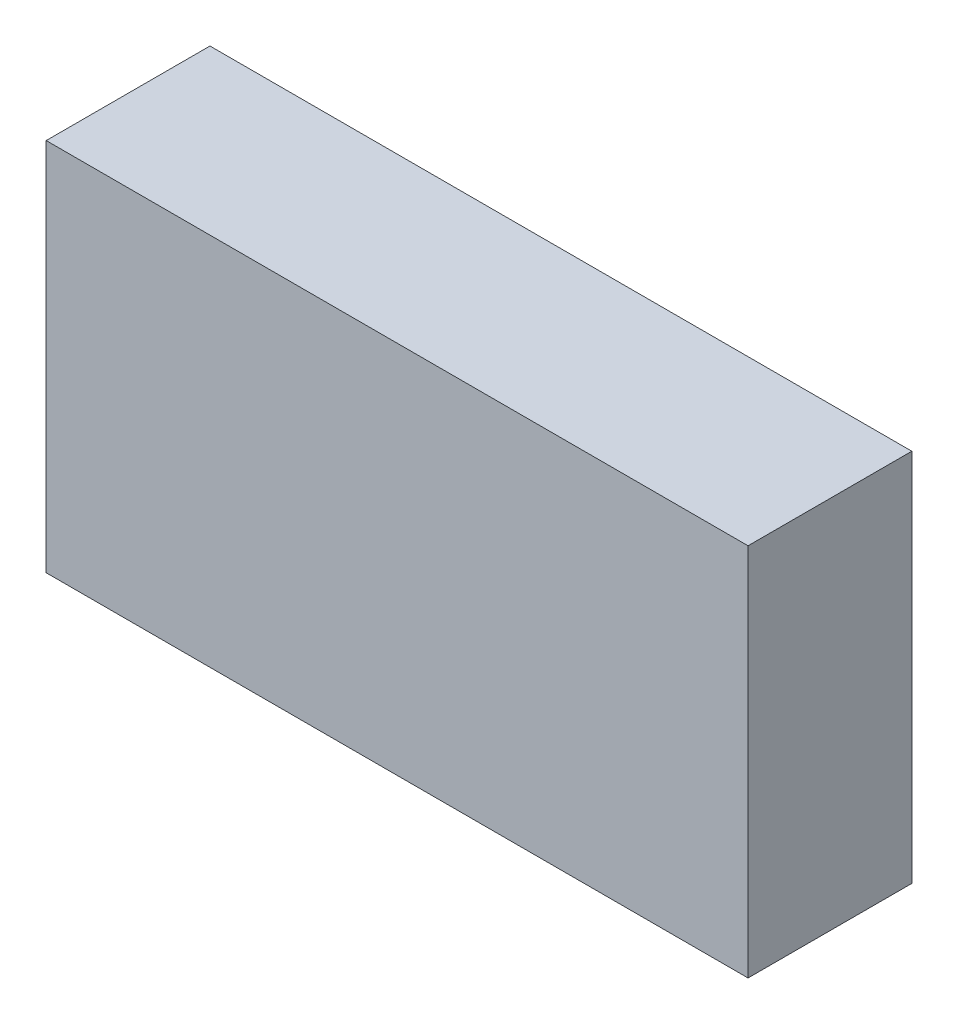
ISO-10303-21;
HEADER;
FILE_DESCRIPTION(('STEP AP214'),'2;1');
FILE_NAME('part.step','',(''),(''),'','','');
FILE_SCHEMA(('AUTOMOTIVE_DESIGN { 1 0 10303 214 1 1 1 1 }'));
ENDSEC;
DATA;
#1=APPLICATION_CONTEXT('core data for automotive mechanical design processes');
#2=APPLICATION_PROTOCOL_DEFINITION('international standard','automotive_design',2000,#1);
#3=PRODUCT_CONTEXT('',#1,'mechanical');
#4=PRODUCT('Part','Part','',(#3));
#5=PRODUCT_RELATED_PRODUCT_CATEGORY('part','',(#4));
#6=PRODUCT_DEFINITION_FORMATION('','',#4);
#7=PRODUCT_DEFINITION_CONTEXT('part definition',#1,'design');
#8=PRODUCT_DEFINITION('design','',#6,#7);
#9=PRODUCT_DEFINITION_SHAPE('','',#8);
#10=(LENGTH_UNIT() NAMED_UNIT(*) SI_UNIT(.MILLI.,.METRE.));
#11=(NAMED_UNIT(*) PLANE_ANGLE_UNIT() SI_UNIT($,.RADIAN.));
#12=(NAMED_UNIT(*) SI_UNIT($,.STERADIAN.) SOLID_ANGLE_UNIT());
#13=UNCERTAINTY_MEASURE_WITH_UNIT(LENGTH_MEASURE(1.E-05),#10,'distance_accuracy_value','');
#14=(GEOMETRIC_REPRESENTATION_CONTEXT(3) GLOBAL_UNCERTAINTY_ASSIGNED_CONTEXT((#13)) GLOBAL_UNIT_ASSIGNED_CONTEXT((#10,
#11,#12)) REPRESENTATION_CONTEXT('',''));
#15=CARTESIAN_POINT('',(0.,0.,0.));
#16=DIRECTION('',(0.,0.,1.));
#17=DIRECTION('',(1.,0.,0.));
#18=AXIS2_PLACEMENT_3D('',#15,#16,#17);
#19=CARTESIAN_POINT('',(0.,-0.4,0.4));
#20=DIRECTION('',(0.,0.,-1.));
#21=DIRECTION('',(-1.,0.,0.));
#22=AXIS2_PLACEMENT_3D('',#19,#20,#21);
#23=PLANE('',#22);
#24=DIRECTION('',(0.,1.,0.));
#25=VECTOR('',#24,1.);
#26=CARTESIAN_POINT('',(-0.75,-0.4,0.4));
#27=LINE('',#26,#25);
#28=CARTESIAN_POINT('',(-0.75,0.4,0.4));
#29=VERTEX_POINT('',#28);
#30=CARTESIAN_POINT('',(-0.75,-0.4,0.4));
#31=VERTEX_POINT('',#30);
#32=EDGE_CURVE('E79',#29,#31,#27,.F.);
#33=ORIENTED_EDGE('',*,*,#32,.T.);
#34=DIRECTION('',(1.,0.,0.));
#35=VECTOR('',#34,1.);
#36=CARTESIAN_POINT('',(0.,-0.4,0.4));
#37=LINE('',#36,#35);
#38=CARTESIAN_POINT('',(0.75,-0.4,0.4));
#39=VERTEX_POINT('',#38);
#40=EDGE_CURVE('E68',#39,#31,#37,.F.);
#41=ORIENTED_EDGE('',*,*,#40,.F.);
#42=DIRECTION('',(0.,1.,0.));
#43=VECTOR('',#42,1.);
#44=CARTESIAN_POINT('',(0.75,-0.4,0.4));
#45=LINE('',#44,#43);
#46=CARTESIAN_POINT('',(0.75,0.4,0.4));
#47=VERTEX_POINT('',#46);
#48=EDGE_CURVE('E56',#47,#39,#45,.F.);
#49=ORIENTED_EDGE('',*,*,#48,.F.);
#50=DIRECTION('',(1.,0.,0.));
#51=VECTOR('',#50,1.);
#52=CARTESIAN_POINT('',(0.,0.4,0.4));
#53=LINE('',#52,#51);
#54=EDGE_CURVE('E20',#47,#29,#53,.F.);
#55=ORIENTED_EDGE('',*,*,#54,.T.);
#56=EDGE_LOOP('',(#33,#41,#49,#55));
#57=FACE_BOUND('',#56,.T.);
#58=ADVANCED_FACE('F17',(#57),#23,.F.);
#59=CARTESIAN_POINT('',(0.,0.4,0.225));
#60=DIRECTION('',(0.,-1.,0.));
#61=DIRECTION('',(0.,0.,-1.));
#62=AXIS2_PLACEMENT_3D('',#59,#60,#61);
#63=PLANE('',#62);
#64=DIRECTION('',(-1.,0.,0.));
#65=VECTOR('',#64,1.);
#66=CARTESIAN_POINT('',(0.,0.4,0.049999999999999));
#67=LINE('',#66,#65);
#68=CARTESIAN_POINT('',(-0.75,0.4,0.0499999999999989));
#69=VERTEX_POINT('',#68);
#70=CARTESIAN_POINT('',(0.75,0.4,0.049999999999999));
#71=VERTEX_POINT('',#70);
#72=EDGE_CURVE('E83',#69,#71,#67,.F.);
#73=ORIENTED_EDGE('',*,*,#72,.F.);
#74=DIRECTION('',(0.,0.,-1.));
#75=VECTOR('',#74,1.);
#76=CARTESIAN_POINT('',(-0.75,0.4,0.225));
#77=LINE('',#76,#75);
#78=EDGE_CURVE('E65',#69,#29,#77,.F.);
#79=ORIENTED_EDGE('',*,*,#78,.T.);
#80=ORIENTED_EDGE('',*,*,#54,.F.);
#81=DIRECTION('',(0.,0.,-1.));
#82=VECTOR('',#81,1.);
#83=CARTESIAN_POINT('',(0.75,0.4,0.225));
#84=LINE('',#83,#82);
#85=EDGE_CURVE('E62',#71,#47,#84,.F.);
#86=ORIENTED_EDGE('',*,*,#85,.F.);
#87=EDGE_LOOP('',(#73,#79,#80,#86));
#88=FACE_BOUND('',#87,.T.);
#89=ADVANCED_FACE('F61',(#88),#63,.F.);
#90=CARTESIAN_POINT('',(0.75,-0.4,0.225));
#91=DIRECTION('',(1.,0.,0.));
#92=DIRECTION('',(0.,0.,-1.));
#93=AXIS2_PLACEMENT_3D('',#90,#91,#92);
#94=PLANE('',#93);
#95=DIRECTION('',(0.,0.,-1.));
#96=VECTOR('',#95,1.);
#97=CARTESIAN_POINT('',(0.75,-0.4,0.225));
#98=LINE('',#97,#96);
#99=CARTESIAN_POINT('',(0.75,-0.4,0.049999999999999));
#100=VERTEX_POINT('',#99);
#101=EDGE_CURVE('E70',#100,#39,#98,.F.);
#102=ORIENTED_EDGE('',*,*,#101,.F.);
#103=DIRECTION('',(0.,1.,0.));
#104=VECTOR('',#103,1.);
#105=CARTESIAN_POINT('',(0.75,-0.4,0.0499999999999991));
#106=LINE('',#105,#104);
#107=EDGE_CURVE('E74',#71,#100,#106,.F.);
#108=ORIENTED_EDGE('',*,*,#107,.F.);
#109=ORIENTED_EDGE('',*,*,#85,.T.);
#110=ORIENTED_EDGE('',*,*,#48,.T.);
#111=EDGE_LOOP('',(#102,#108,#109,#110));
#112=FACE_BOUND('',#111,.T.);
#113=ADVANCED_FACE('F72',(#112),#94,.T.);
#114=CARTESIAN_POINT('',(0.,-0.4,0.225));
#115=DIRECTION('',(0.,-1.,0.));
#116=DIRECTION('',(0.,0.,-1.));
#117=AXIS2_PLACEMENT_3D('',#114,#115,#116);
#118=PLANE('',#117);
#119=DIRECTION('',(0.,0.,-1.));
#120=VECTOR('',#119,1.);
#121=CARTESIAN_POINT('',(-0.75,-0.4,0.225));
#122=LINE('',#121,#120);
#123=CARTESIAN_POINT('',(-0.75,-0.4,0.0499999999999989));
#124=VERTEX_POINT('',#123);
#125=EDGE_CURVE('E35',#31,#124,#122,.T.);
#126=ORIENTED_EDGE('',*,*,#125,.T.);
#127=DIRECTION('',(-1.,0.,0.));
#128=VECTOR('',#127,1.);
#129=CARTESIAN_POINT('',(0.,-0.4,0.049999999999999));
#130=LINE('',#129,#128);
#131=EDGE_CURVE('E26',#100,#124,#130,.T.);
#132=ORIENTED_EDGE('',*,*,#131,.F.);
#133=ORIENTED_EDGE('',*,*,#101,.T.);
#134=ORIENTED_EDGE('',*,*,#40,.T.);
#135=EDGE_LOOP('',(#126,#132,#133,#134));
#136=FACE_BOUND('',#135,.T.);
#137=ADVANCED_FACE('F89',(#136),#118,.T.);
#138=CARTESIAN_POINT('',(-0.75,-0.4,0.225));
#139=DIRECTION('',(1.,0.,0.));
#140=DIRECTION('',(0.,0.,-1.));
#141=AXIS2_PLACEMENT_3D('',#138,#139,#140);
#142=PLANE('',#141);
#143=DIRECTION('',(0.,1.,0.));
#144=VECTOR('',#143,1.);
#145=CARTESIAN_POINT('',(-0.75,-0.4,0.0499999999999989));
#146=LINE('',#145,#144);
#147=EDGE_CURVE('E11',#124,#69,#146,.T.);
#148=ORIENTED_EDGE('',*,*,#147,.F.);
#149=ORIENTED_EDGE('',*,*,#125,.F.);
#150=ORIENTED_EDGE('',*,*,#32,.F.);
#151=ORIENTED_EDGE('',*,*,#78,.F.);
#152=EDGE_LOOP('',(#148,#149,#150,#151));
#153=FACE_BOUND('',#152,.T.);
#154=ADVANCED_FACE('F91',(#153),#142,.F.);
#155=CARTESIAN_POINT('',(0.,-0.4,0.049999999999999));
#156=DIRECTION('',(0.,0.,-1.));
#157=DIRECTION('',(-1.,0.,0.));
#158=AXIS2_PLACEMENT_3D('',#155,#156,#157);
#159=PLANE('',#158);
#160=ORIENTED_EDGE('',*,*,#131,.T.);
#161=ORIENTED_EDGE('',*,*,#147,.T.);
#162=ORIENTED_EDGE('',*,*,#72,.T.);
#163=ORIENTED_EDGE('',*,*,#107,.T.);
#164=EDGE_LOOP('',(#160,#161,#162,#163));
#165=FACE_BOUND('',#164,.T.);
#166=ADVANCED_FACE('F88',(#165),#159,.T.);
#167=CLOSED_SHELL('',(#58,#89,#113,#137,#154,#166));
#168=MANIFOLD_SOLID_BREP('B1',#167);
#169=ADVANCED_BREP_SHAPE_REPRESENTATION('',(#18,#168),#14);
#170=SHAPE_DEFINITION_REPRESENTATION(#9,#169);
ENDSEC;
END-ISO-10303-21;
